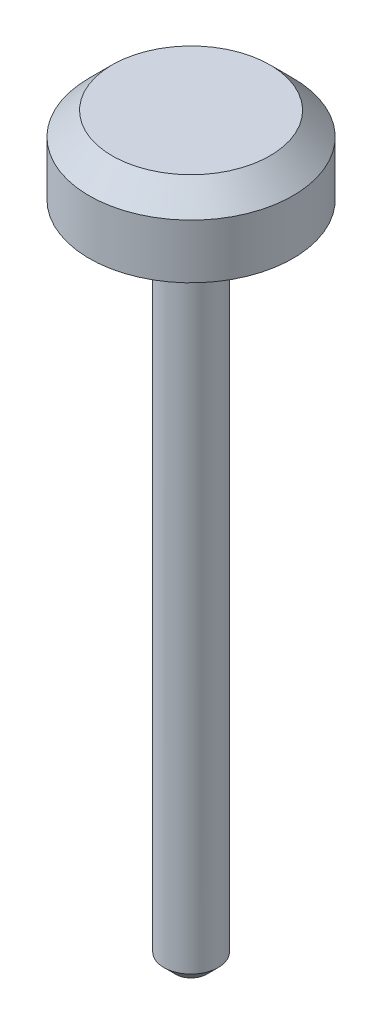
ISO-10303-21;
HEADER;
FILE_DESCRIPTION(('STEP AP214'),'2;1');
FILE_NAME('part.step','',(''),(''),'','','');
FILE_SCHEMA(('AUTOMOTIVE_DESIGN { 1 0 10303 214 1 1 1 1 }'));
ENDSEC;
DATA;
#1=APPLICATION_CONTEXT('core data for automotive mechanical design processes');
#2=APPLICATION_PROTOCOL_DEFINITION('international standard','automotive_design',2000,#1);
#3=PRODUCT_CONTEXT('',#1,'mechanical');
#4=PRODUCT('Part','Part','',(#3));
#5=PRODUCT_RELATED_PRODUCT_CATEGORY('part','',(#4));
#6=PRODUCT_DEFINITION_FORMATION('','',#4);
#7=PRODUCT_DEFINITION_CONTEXT('part definition',#1,'design');
#8=PRODUCT_DEFINITION('design','',#6,#7);
#9=PRODUCT_DEFINITION_SHAPE('','',#8);
#10=(LENGTH_UNIT() NAMED_UNIT(*) SI_UNIT(.MILLI.,.METRE.));
#11=(NAMED_UNIT(*) PLANE_ANGLE_UNIT() SI_UNIT($,.RADIAN.));
#12=(NAMED_UNIT(*) SI_UNIT($,.STERADIAN.) SOLID_ANGLE_UNIT());
#13=UNCERTAINTY_MEASURE_WITH_UNIT(LENGTH_MEASURE(1.E-05),#10,'distance_accuracy_value','');
#14=(GEOMETRIC_REPRESENTATION_CONTEXT(3) GLOBAL_UNCERTAINTY_ASSIGNED_CONTEXT((#13)) GLOBAL_UNIT_ASSIGNED_CONTEXT((#10,
#11,#12)) REPRESENTATION_CONTEXT('',''));
#15=CARTESIAN_POINT('',(0.,0.,0.));
#16=DIRECTION('',(0.,0.,1.));
#17=DIRECTION('',(1.,0.,0.));
#18=AXIS2_PLACEMENT_3D('',#15,#16,#17);
#19=CARTESIAN_POINT('',(0.,22.3137881440992,0.));
#20=DIRECTION('',(0.,1.,0.));
#21=DIRECTION('',(-1.,0.,0.));
#22=AXIS2_PLACEMENT_3D('',#19,#20,#21);
#23=PLANE('',#22);
#24=CARTESIAN_POINT('',(0.,22.3137881440992,0.));
#25=DIRECTION('',(0.,1.,0.));
#26=DIRECTION('',(-1.,0.,0.));
#27=AXIS2_PLACEMENT_3D('',#24,#25,#26);
#28=CIRCLE('',#27,7.26486255902486);
#29=CARTESIAN_POINT('',(-7.26486255902486,22.3137881440992,0.));
#30=VERTEX_POINT('',#29);
#31=EDGE_CURVE('E52',#30,#30,#28,.T.);
#32=ORIENTED_EDGE('',*,*,#31,.T.);
#33=EDGE_LOOP('',(#32));
#34=FACE_BOUND('',#33,.T.);
#35=ADVANCED_FACE('F40',(#34),#23,.T.);
#36=CARTESIAN_POINT('',(0.,22.3137881440992,0.));
#37=DIRECTION('',(0.,-1.,0.));
#38=DIRECTION('',(1.,0.,0.));
#39=AXIS2_PLACEMENT_3D('',#36,#37,#38);
#40=CONICAL_SURFACE('',#39,7.26486255902486,0.785398163397438);
#41=CARTESIAN_POINT('',(0.,20.1924678005395,0.));
#42=DIRECTION('',(0.,1.,0.));
#43=DIRECTION('',(-1.,0.,0.));
#44=AXIS2_PLACEMENT_3D('',#41,#42,#43);
#45=CIRCLE('',#44,9.38618290258449);
#46=CARTESIAN_POINT('',(-9.38618290258448,20.1924678005395,0.));
#47=VERTEX_POINT('',#46);
#48=EDGE_CURVE('E56',#47,#47,#45,.T.);
#49=ORIENTED_EDGE('',*,*,#48,.T.);
#50=EDGE_LOOP('',(#49));
#51=FACE_BOUND('',#50,.T.);
#52=ORIENTED_EDGE('',*,*,#31,.F.);
#53=EDGE_LOOP('',(#52));
#54=FACE_BOUND('',#53,.T.);
#55=ADVANCED_FACE('F85',(#51,#54),#40,.T.);
#56=CARTESIAN_POINT('',(0.,22.3137881440992,0.));
#57=DIRECTION('',(0.,1.,0.));
#58=DIRECTION('',(-1.,0.,0.));
#59=AXIS2_PLACEMENT_3D('',#56,#57,#58);
#60=CYLINDRICAL_SURFACE('',#59,9.38618290258449);
#61=CARTESIAN_POINT('',(0.,15.1924678005395,0.));
#62=DIRECTION('',(0.,1.,0.));
#63=DIRECTION('',(-1.,0.,0.));
#64=AXIS2_PLACEMENT_3D('',#61,#62,#63);
#65=CIRCLE('',#64,9.38618290258449);
#66=CARTESIAN_POINT('',(-9.38618290258448,15.1924678005395,0.));
#67=VERTEX_POINT('',#66);
#68=EDGE_CURVE('E61',#67,#67,#65,.T.);
#69=ORIENTED_EDGE('',*,*,#68,.T.);
#70=EDGE_LOOP('',(#69));
#71=FACE_BOUND('',#70,.T.);
#72=ORIENTED_EDGE('',*,*,#48,.F.);
#73=EDGE_LOOP('',(#72));
#74=FACE_BOUND('',#73,.T.);
#75=ADVANCED_FACE('F90',(#71,#74),#60,.T.);
#76=CARTESIAN_POINT('',(-9.38618290258448,15.1924678005395,0.));
#77=DIRECTION('',(0.,-1.,0.));
#78=DIRECTION('',(1.,0.,0.));
#79=AXIS2_PLACEMENT_3D('',#76,#77,#78);
#80=PLANE('',#79);
#81=CARTESIAN_POINT('',(0.,15.1924678005395,0.));
#82=DIRECTION('',(0.,-1.,0.));
#83=DIRECTION('',(1.,0.,0.));
#84=AXIS2_PLACEMENT_3D('',#81,#82,#83);
#85=CIRCLE('',#84,3.50000000000001);
#86=CARTESIAN_POINT('',(3.50000000000002,15.1924678005395,0.));
#87=VERTEX_POINT('',#86);
#88=EDGE_CURVE('E48',#87,#87,#85,.F.);
#89=ORIENTED_EDGE('',*,*,#88,.T.);
#90=EDGE_LOOP('',(#89));
#91=FACE_BOUND('',#90,.T.);
#92=ORIENTED_EDGE('',*,*,#68,.F.);
#93=EDGE_LOOP('',(#92));
#94=FACE_BOUND('',#93,.T.);
#95=ADVANCED_FACE('F96',(#91,#94),#80,.T.);
#96=CARTESIAN_POINT('',(0.,22.3137881440992,0.));
#97=DIRECTION('',(0.,1.,0.));
#98=DIRECTION('',(-1.,0.,0.));
#99=AXIS2_PLACEMENT_3D('',#96,#97,#98);
#100=CYLINDRICAL_SURFACE('',#99,2.49999999999999);
#101=CARTESIAN_POINT('',(0.,14.1924678005395,0.));
#102=DIRECTION('',(0.,-1.,0.));
#103=DIRECTION('',(1.,0.,0.));
#104=AXIS2_PLACEMENT_3D('',#101,#102,#103);
#105=CIRCLE('',#104,2.49999999999999);
#106=CARTESIAN_POINT('',(2.5,14.1924678005395,0.));
#107=VERTEX_POINT('',#106);
#108=EDGE_CURVE('E10',#107,#107,#105,.T.);
#109=ORIENTED_EDGE('',*,*,#108,.T.);
#110=EDGE_LOOP('',(#109));
#111=FACE_BOUND('',#110,.T.);
#112=CARTESIAN_POINT('',(0.,-44.8075321994605,0.));
#113=DIRECTION('',(0.,1.,0.));
#114=DIRECTION('',(-1.,0.,0.));
#115=AXIS2_PLACEMENT_3D('',#112,#113,#114);
#116=CIRCLE('',#115,2.49999999999998);
#117=CARTESIAN_POINT('',(-2.49999999999998,-44.8075321994605,0.));
#118=VERTEX_POINT('',#117);
#119=EDGE_CURVE('E64',#118,#118,#116,.T.);
#120=ORIENTED_EDGE('',*,*,#119,.T.);
#121=EDGE_LOOP('',(#120));
#122=FACE_BOUND('',#121,.T.);
#123=ADVANCED_FACE('F82',(#111,#122),#100,.T.);
#124=CARTESIAN_POINT('',(0.,-44.8075321994605,0.));
#125=DIRECTION('',(0.,1.,0.));
#126=DIRECTION('',(-1.,0.,0.));
#127=AXIS2_PLACEMENT_3D('',#124,#125,#126);
#128=CONICAL_SURFACE('',#127,2.49999999999998,0.78539816339746);
#129=CARTESIAN_POINT('',(0.,-45.8681923712403,0.));
#130=DIRECTION('',(0.,1.,0.));
#131=DIRECTION('',(-1.,0.,0.));
#132=AXIS2_PLACEMENT_3D('',#129,#130,#131);
#133=CIRCLE('',#132,1.43933982822015);
#134=CARTESIAN_POINT('',(-1.43933982822015,-45.8681923712403,0.));
#135=VERTEX_POINT('',#134);
#136=EDGE_CURVE('E67',#135,#135,#133,.T.);
#137=ORIENTED_EDGE('',*,*,#136,.T.);
#138=EDGE_LOOP('',(#137));
#139=FACE_BOUND('',#138,.T.);
#140=ORIENTED_EDGE('',*,*,#119,.F.);
#141=EDGE_LOOP('',(#140));
#142=FACE_BOUND('',#141,.T.);
#143=ADVANCED_FACE('F71',(#139,#142),#128,.T.);
#144=CARTESIAN_POINT('',(-1.43933982822015,-45.8681923712403,0.));
#145=DIRECTION('',(0.,-1.,0.));
#146=DIRECTION('',(1.,0.,0.));
#147=AXIS2_PLACEMENT_3D('',#144,#145,#146);
#148=PLANE('',#147);
#149=ORIENTED_EDGE('',*,*,#136,.F.);
#150=EDGE_LOOP('',(#149));
#151=FACE_BOUND('',#150,.T.);
#152=ADVANCED_FACE('F74',(#151),#148,.T.);
#153=CARTESIAN_POINT('',(0.,15.1924678005395,0.));
#154=DIRECTION('',(0.,1.,0.));
#155=DIRECTION('',(-1.,0.,0.));
#156=AXIS2_PLACEMENT_3D('',#153,#154,#155);
#157=CONICAL_SURFACE('',#156,3.50000000000001,0.785398163397455);
#158=ORIENTED_EDGE('',*,*,#108,.F.);
#159=EDGE_LOOP('',(#158));
#160=FACE_BOUND('',#159,.T.);
#161=ORIENTED_EDGE('',*,*,#88,.F.);
#162=EDGE_LOOP('',(#161));
#163=FACE_BOUND('',#162,.T.);
#164=ADVANCED_FACE('F43',(#160,#163),#157,.T.);
#165=CLOSED_SHELL('',(#35,#55,#75,#95,#123,#143,#152,#164));
#166=MANIFOLD_SOLID_BREP('B2',#165);
#167=ADVANCED_BREP_SHAPE_REPRESENTATION('',(#18,#166),#14);
#168=SHAPE_DEFINITION_REPRESENTATION(#9,#167);
ENDSEC;
END-ISO-10303-21;
